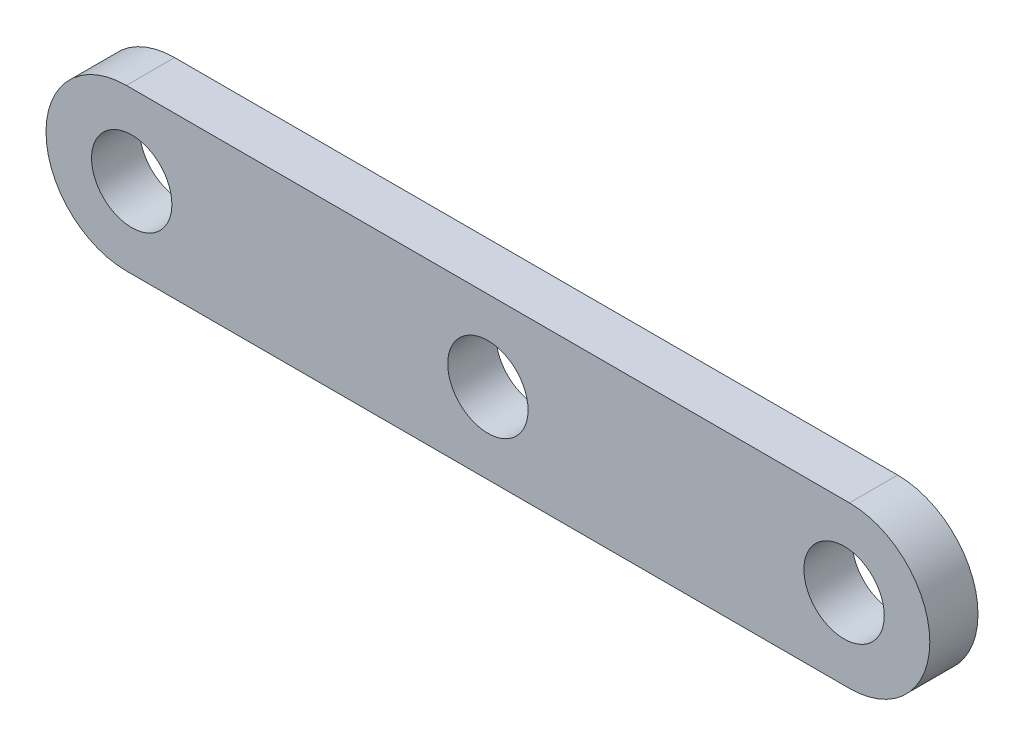
ISO-10303-21;
HEADER;
FILE_DESCRIPTION(('STEP AP214'),'2;1');
FILE_NAME('part.step','',(''),(''),'','','');
FILE_SCHEMA(('AUTOMOTIVE_DESIGN { 1 0 10303 214 1 1 1 1 }'));
ENDSEC;
DATA;
#1=APPLICATION_CONTEXT('core data for automotive mechanical design processes');
#2=APPLICATION_PROTOCOL_DEFINITION('international standard','automotive_design',2000,#1);
#3=PRODUCT_CONTEXT('',#1,'mechanical');
#4=PRODUCT('Part','Part','',(#3));
#5=PRODUCT_RELATED_PRODUCT_CATEGORY('part','',(#4));
#6=PRODUCT_DEFINITION_FORMATION('','',#4);
#7=PRODUCT_DEFINITION_CONTEXT('part definition',#1,'design');
#8=PRODUCT_DEFINITION('design','',#6,#7);
#9=PRODUCT_DEFINITION_SHAPE('','',#8);
#10=(LENGTH_UNIT() NAMED_UNIT(*) SI_UNIT(.MILLI.,.METRE.));
#11=(NAMED_UNIT(*) PLANE_ANGLE_UNIT() SI_UNIT($,.RADIAN.));
#12=(NAMED_UNIT(*) SI_UNIT($,.STERADIAN.) SOLID_ANGLE_UNIT());
#13=UNCERTAINTY_MEASURE_WITH_UNIT(LENGTH_MEASURE(1.E-05),#10,'distance_accuracy_value','');
#14=(GEOMETRIC_REPRESENTATION_CONTEXT(3) GLOBAL_UNCERTAINTY_ASSIGNED_CONTEXT((#13)) GLOBAL_UNIT_ASSIGNED_CONTEXT((#10,
#11,#12)) REPRESENTATION_CONTEXT('',''));
#15=CARTESIAN_POINT('',(0.,0.,0.));
#16=DIRECTION('',(0.,0.,1.));
#17=DIRECTION('',(1.,0.,0.));
#18=AXIS2_PLACEMENT_3D('',#15,#16,#17);
#19=CARTESIAN_POINT('',(-65.2182972437161,0.,3.));
#20=DIRECTION('',(0.,0.,1.));
#21=DIRECTION('',(1.,0.,0.));
#22=AXIS2_PLACEMENT_3D('',#19,#20,#21);
#23=PLANE('',#22);
#24=CARTESIAN_POINT('',(-42.7182972437161,0.,3.));
#25=DIRECTION('',(0.,0.,1.));
#26=DIRECTION('',(1.,0.,0.));
#27=AXIS2_PLACEMENT_3D('',#24,#25,#26);
#28=CIRCLE('',#27,2.5);
#29=CARTESIAN_POINT('',(-40.2182972437161,0.,3.));
#30=VERTEX_POINT('',#29);
#31=EDGE_CURVE('E113',#30,#30,#28,.T.);
#32=ORIENTED_EDGE('',*,*,#31,.F.);
#33=EDGE_LOOP('',(#32));
#34=FACE_BOUND('',#33,.T.);
#35=CARTESIAN_POINT('',(-65.2182972437161,0.,3.));
#36=DIRECTION('',(0.,0.,1.));
#37=DIRECTION('',(1.,0.,0.));
#38=AXIS2_PLACEMENT_3D('',#35,#36,#37);
#39=CIRCLE('',#38,5.);
#40=CARTESIAN_POINT('',(-65.2182972437161,5.,3.));
#41=VERTEX_POINT('',#40);
#42=CARTESIAN_POINT('',(-65.2182972437161,-5.,3.));
#43=VERTEX_POINT('',#42);
#44=EDGE_CURVE('E83',#41,#43,#39,.T.);
#45=ORIENTED_EDGE('',*,*,#44,.T.);
#46=DIRECTION('',(1.,0.,0.));
#47=VECTOR('',#46,1.);
#48=CARTESIAN_POINT('',(-65.2182972437161,-5.,3.));
#49=LINE('',#48,#47);
#50=CARTESIAN_POINT('',(-20.2182972437161,-5.,3.));
#51=VERTEX_POINT('',#50);
#52=EDGE_CURVE('E78',#43,#51,#49,.T.);
#53=ORIENTED_EDGE('',*,*,#52,.T.);
#54=CARTESIAN_POINT('',(-20.2182972437161,0.,3.));
#55=DIRECTION('',(0.,0.,1.));
#56=DIRECTION('',(1.,0.,0.));
#57=AXIS2_PLACEMENT_3D('',#54,#55,#56);
#58=CIRCLE('',#57,5.);
#59=CARTESIAN_POINT('',(-20.2182972437161,5.,3.));
#60=VERTEX_POINT('',#59);
#61=EDGE_CURVE('E81',#51,#60,#58,.T.);
#62=ORIENTED_EDGE('',*,*,#61,.T.);
#63=DIRECTION('',(-1.,0.,0.));
#64=VECTOR('',#63,1.);
#65=CARTESIAN_POINT('',(-65.2182972437161,5.,3.));
#66=LINE('',#65,#64);
#67=EDGE_CURVE('E48',#60,#41,#66,.T.);
#68=ORIENTED_EDGE('',*,*,#67,.T.);
#69=EDGE_LOOP('',(#45,#53,#62,#68));
#70=FACE_BOUND('',#69,.T.);
#71=CARTESIAN_POINT('',(-64.88438000545,0.,3.));
#72=DIRECTION('',(0.,0.,1.));
#73=DIRECTION('',(1.,0.,0.));
#74=AXIS2_PLACEMENT_3D('',#71,#72,#73);
#75=CIRCLE('',#74,2.5);
#76=CARTESIAN_POINT('',(-62.38438000545,0.,3.));
#77=VERTEX_POINT('',#76);
#78=EDGE_CURVE('E98',#77,#77,#75,.T.);
#79=ORIENTED_EDGE('',*,*,#78,.F.);
#80=EDGE_LOOP('',(#79));
#81=FACE_BOUND('',#80,.T.);
#82=CARTESIAN_POINT('',(-20.5522144819823,0.,3.));
#83=DIRECTION('',(0.,0.,1.));
#84=DIRECTION('',(1.,0.,0.));
#85=AXIS2_PLACEMENT_3D('',#82,#83,#84);
#86=CIRCLE('',#85,2.5);
#87=CARTESIAN_POINT('',(-18.0522144819823,0.,3.));
#88=VERTEX_POINT('',#87);
#89=EDGE_CURVE('E119',#88,#88,#86,.T.);
#90=ORIENTED_EDGE('',*,*,#89,.F.);
#91=EDGE_LOOP('',(#90));
#92=FACE_BOUND('',#91,.T.);
#93=ADVANCED_FACE('F31',(#34,#70,#81,#92),#23,.T.);
#94=CARTESIAN_POINT('',(-65.2182972437161,0.,0.));
#95=DIRECTION('',(0.,0.,1.));
#96=DIRECTION('',(1.,0.,0.));
#97=AXIS2_PLACEMENT_3D('',#94,#95,#96);
#98=PLANE('',#97);
#99=CARTESIAN_POINT('',(-42.7182972437161,0.,0.));
#100=DIRECTION('',(0.,0.,1.));
#101=DIRECTION('',(1.,0.,0.));
#102=AXIS2_PLACEMENT_3D('',#99,#100,#101);
#103=CIRCLE('',#102,2.5);
#104=CARTESIAN_POINT('',(-40.2182972437161,0.,0.));
#105=VERTEX_POINT('',#104);
#106=EDGE_CURVE('E116',#105,#105,#103,.T.);
#107=ORIENTED_EDGE('',*,*,#106,.T.);
#108=EDGE_LOOP('',(#107));
#109=FACE_BOUND('',#108,.T.);
#110=CARTESIAN_POINT('',(-65.2182972437161,0.,0.));
#111=DIRECTION('',(0.,0.,1.));
#112=DIRECTION('',(1.,0.,0.));
#113=AXIS2_PLACEMENT_3D('',#110,#111,#112);
#114=CIRCLE('',#113,5.);
#115=CARTESIAN_POINT('',(-65.2182972437161,5.,0.));
#116=VERTEX_POINT('',#115);
#117=CARTESIAN_POINT('',(-65.2182972437161,-5.,0.));
#118=VERTEX_POINT('',#117);
#119=EDGE_CURVE('E95',#116,#118,#114,.T.);
#120=ORIENTED_EDGE('',*,*,#119,.F.);
#121=DIRECTION('',(-1.,0.,0.));
#122=VECTOR('',#121,1.);
#123=CARTESIAN_POINT('',(-65.2182972437161,5.,0.));
#124=LINE('',#123,#122);
#125=CARTESIAN_POINT('',(-20.2182972437161,5.,0.));
#126=VERTEX_POINT('',#125);
#127=EDGE_CURVE('E71',#126,#116,#124,.T.);
#128=ORIENTED_EDGE('',*,*,#127,.F.);
#129=CARTESIAN_POINT('',(-20.2182972437161,0.,0.));
#130=DIRECTION('',(0.,0.,1.));
#131=DIRECTION('',(1.,0.,0.));
#132=AXIS2_PLACEMENT_3D('',#129,#130,#131);
#133=CIRCLE('',#132,5.);
#134=CARTESIAN_POINT('',(-20.2182972437161,-5.,0.));
#135=VERTEX_POINT('',#134);
#136=EDGE_CURVE('E65',#135,#126,#133,.T.);
#137=ORIENTED_EDGE('',*,*,#136,.F.);
#138=DIRECTION('',(1.,0.,0.));
#139=VECTOR('',#138,1.);
#140=CARTESIAN_POINT('',(-65.2182972437161,-5.,0.));
#141=LINE('',#140,#139);
#142=EDGE_CURVE('E87',#118,#135,#141,.T.);
#143=ORIENTED_EDGE('',*,*,#142,.F.);
#144=EDGE_LOOP('',(#120,#128,#137,#143));
#145=FACE_BOUND('',#144,.T.);
#146=CARTESIAN_POINT('',(-64.88438000545,0.,0.));
#147=DIRECTION('',(0.,0.,1.));
#148=DIRECTION('',(1.,0.,0.));
#149=AXIS2_PLACEMENT_3D('',#146,#147,#148);
#150=CIRCLE('',#149,2.5);
#151=CARTESIAN_POINT('',(-62.38438000545,0.,0.));
#152=VERTEX_POINT('',#151);
#153=EDGE_CURVE('E110',#152,#152,#150,.T.);
#154=ORIENTED_EDGE('',*,*,#153,.T.);
#155=EDGE_LOOP('',(#154));
#156=FACE_BOUND('',#155,.T.);
#157=CARTESIAN_POINT('',(-20.5522144819823,0.,0.));
#158=DIRECTION('',(0.,0.,1.));
#159=DIRECTION('',(1.,0.,0.));
#160=AXIS2_PLACEMENT_3D('',#157,#158,#159);
#161=CIRCLE('',#160,2.5);
#162=CARTESIAN_POINT('',(-18.0522144819823,0.,0.));
#163=VERTEX_POINT('',#162);
#164=EDGE_CURVE('E122',#163,#163,#161,.T.);
#165=ORIENTED_EDGE('',*,*,#164,.T.);
#166=EDGE_LOOP('',(#165));
#167=FACE_BOUND('',#166,.T.);
#168=ADVANCED_FACE('F106',(#109,#145,#156,#167),#98,.F.);
#169=CARTESIAN_POINT('',(-65.2182972437161,0.,3.));
#170=DIRECTION('',(0.,0.,-1.));
#171=DIRECTION('',(-1.,0.,0.));
#172=AXIS2_PLACEMENT_3D('',#169,#170,#171);
#173=CYLINDRICAL_SURFACE('',#172,5.);
#174=ORIENTED_EDGE('',*,*,#119,.T.);
#175=DIRECTION('',(0.,0.,-1.));
#176=VECTOR('',#175,1.);
#177=CARTESIAN_POINT('',(-65.2182972437161,-5.,3.));
#178=LINE('',#177,#176);
#179=EDGE_CURVE('E11',#43,#118,#178,.T.);
#180=ORIENTED_EDGE('',*,*,#179,.F.);
#181=ORIENTED_EDGE('',*,*,#44,.F.);
#182=DIRECTION('',(0.,0.,-1.));
#183=VECTOR('',#182,1.);
#184=CARTESIAN_POINT('',(-65.2182972437161,5.,3.));
#185=LINE('',#184,#183);
#186=EDGE_CURVE('E91',#41,#116,#185,.T.);
#187=ORIENTED_EDGE('',*,*,#186,.T.);
#188=EDGE_LOOP('',(#174,#180,#181,#187));
#189=FACE_BOUND('',#188,.T.);
#190=ADVANCED_FACE('F33',(#189),#173,.T.);
#191=CARTESIAN_POINT('',(-65.2182972437161,-5.,3.));
#192=DIRECTION('',(0.,1.,0.));
#193=DIRECTION('',(0.,0.,1.));
#194=AXIS2_PLACEMENT_3D('',#191,#192,#193);
#195=PLANE('',#194);
#196=ORIENTED_EDGE('',*,*,#142,.T.);
#197=DIRECTION('',(0.,0.,-1.));
#198=VECTOR('',#197,1.);
#199=CARTESIAN_POINT('',(-20.2182972437161,-5.,3.));
#200=LINE('',#199,#198);
#201=EDGE_CURVE('E40',#51,#135,#200,.T.);
#202=ORIENTED_EDGE('',*,*,#201,.F.);
#203=ORIENTED_EDGE('',*,*,#52,.F.);
#204=ORIENTED_EDGE('',*,*,#179,.T.);
#205=EDGE_LOOP('',(#196,#202,#203,#204));
#206=FACE_BOUND('',#205,.T.);
#207=ADVANCED_FACE('F86',(#206),#195,.F.);
#208=CARTESIAN_POINT('',(-20.2182972437161,0.,3.));
#209=DIRECTION('',(0.,0.,-1.));
#210=DIRECTION('',(-1.,0.,0.));
#211=AXIS2_PLACEMENT_3D('',#208,#209,#210);
#212=CYLINDRICAL_SURFACE('',#211,5.);
#213=ORIENTED_EDGE('',*,*,#136,.T.);
#214=DIRECTION('',(0.,0.,-1.));
#215=VECTOR('',#214,1.);
#216=CARTESIAN_POINT('',(-20.2182972437161,5.,3.));
#217=LINE('',#216,#215);
#218=EDGE_CURVE('E88',#60,#126,#217,.T.);
#219=ORIENTED_EDGE('',*,*,#218,.F.);
#220=ORIENTED_EDGE('',*,*,#61,.F.);
#221=ORIENTED_EDGE('',*,*,#201,.T.);
#222=EDGE_LOOP('',(#213,#219,#220,#221));
#223=FACE_BOUND('',#222,.T.);
#224=ADVANCED_FACE('F89',(#223),#212,.T.);
#225=CARTESIAN_POINT('',(-65.2182972437161,5.,3.));
#226=DIRECTION('',(0.,-1.,0.));
#227=DIRECTION('',(0.,0.,-1.));
#228=AXIS2_PLACEMENT_3D('',#225,#226,#227);
#229=PLANE('',#228);
#230=ORIENTED_EDGE('',*,*,#127,.T.);
#231=ORIENTED_EDGE('',*,*,#186,.F.);
#232=ORIENTED_EDGE('',*,*,#67,.F.);
#233=ORIENTED_EDGE('',*,*,#218,.T.);
#234=EDGE_LOOP('',(#230,#231,#232,#233));
#235=FACE_BOUND('',#234,.T.);
#236=ADVANCED_FACE('F103',(#235),#229,.F.);
#237=CARTESIAN_POINT('',(-64.88438000545,0.,3.));
#238=DIRECTION('',(0.,0.,-1.));
#239=DIRECTION('',(-1.,0.,0.));
#240=AXIS2_PLACEMENT_3D('',#237,#238,#239);
#241=CYLINDRICAL_SURFACE('',#240,2.5);
#242=ORIENTED_EDGE('',*,*,#78,.T.);
#243=EDGE_LOOP('',(#242));
#244=FACE_BOUND('',#243,.T.);
#245=ORIENTED_EDGE('',*,*,#153,.F.);
#246=EDGE_LOOP('',(#245));
#247=FACE_BOUND('',#246,.T.);
#248=ADVANCED_FACE('F141',(#244,#247),#241,.F.);
#249=CARTESIAN_POINT('',(-42.7182972437161,0.,3.));
#250=DIRECTION('',(0.,0.,-1.));
#251=DIRECTION('',(-1.,0.,0.));
#252=AXIS2_PLACEMENT_3D('',#249,#250,#251);
#253=CYLINDRICAL_SURFACE('',#252,2.5);
#254=ORIENTED_EDGE('',*,*,#31,.T.);
#255=EDGE_LOOP('',(#254));
#256=FACE_BOUND('',#255,.T.);
#257=ORIENTED_EDGE('',*,*,#106,.F.);
#258=EDGE_LOOP('',(#257));
#259=FACE_BOUND('',#258,.T.);
#260=ADVANCED_FACE('F187',(#256,#259),#253,.F.);
#261=CARTESIAN_POINT('',(-20.5522144819823,0.,3.));
#262=DIRECTION('',(0.,0.,-1.));
#263=DIRECTION('',(-1.,0.,0.));
#264=AXIS2_PLACEMENT_3D('',#261,#262,#263);
#265=CYLINDRICAL_SURFACE('',#264,2.5);
#266=ORIENTED_EDGE('',*,*,#89,.T.);
#267=EDGE_LOOP('',(#266));
#268=FACE_BOUND('',#267,.T.);
#269=ORIENTED_EDGE('',*,*,#164,.F.);
#270=EDGE_LOOP('',(#269));
#271=FACE_BOUND('',#270,.T.);
#272=ADVANCED_FACE('F128',(#268,#271),#265,.F.);
#273=CLOSED_SHELL('',(#93,#168,#190,#207,#224,#236,#248,#260,#272));
#274=MANIFOLD_SOLID_BREP('B2',#273);
#275=ADVANCED_BREP_SHAPE_REPRESENTATION('',(#18,#274),#14);
#276=SHAPE_DEFINITION_REPRESENTATION(#9,#275);
ENDSEC;
END-ISO-10303-21;
